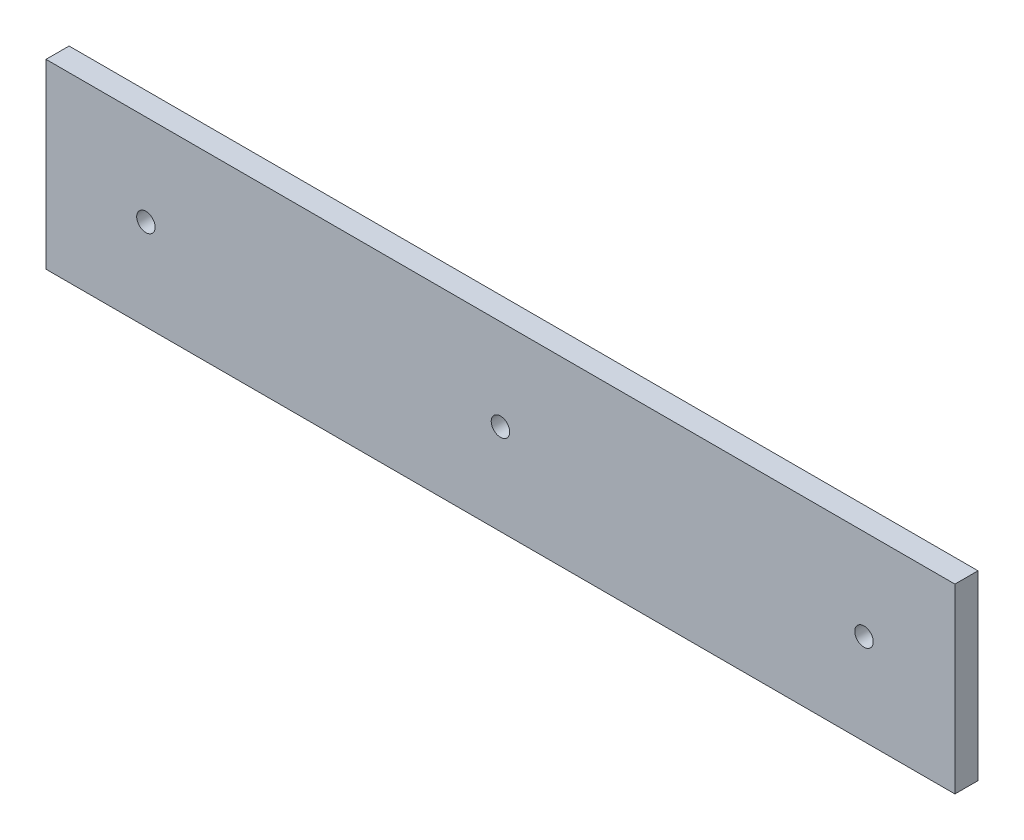
ISO-10303-21;
HEADER;
FILE_DESCRIPTION(('STEP AP214'),'2;1');
FILE_NAME('part.step','',(''),(''),'','','');
FILE_SCHEMA(('AUTOMOTIVE_DESIGN { 1 0 10303 214 1 1 1 1 }'));
ENDSEC;
DATA;
#1=APPLICATION_CONTEXT('core data for automotive mechanical design processes');
#2=APPLICATION_PROTOCOL_DEFINITION('international standard','automotive_design',2000,#1);
#3=PRODUCT_CONTEXT('',#1,'mechanical');
#4=PRODUCT('Part','Part','',(#3));
#5=PRODUCT_RELATED_PRODUCT_CATEGORY('part','',(#4));
#6=PRODUCT_DEFINITION_FORMATION('','',#4);
#7=PRODUCT_DEFINITION_CONTEXT('part definition',#1,'design');
#8=PRODUCT_DEFINITION('design','',#6,#7);
#9=PRODUCT_DEFINITION_SHAPE('','',#8);
#10=(LENGTH_UNIT() NAMED_UNIT(*) SI_UNIT(.MILLI.,.METRE.));
#11=(NAMED_UNIT(*) PLANE_ANGLE_UNIT() SI_UNIT($,.RADIAN.));
#12=(NAMED_UNIT(*) SI_UNIT($,.STERADIAN.) SOLID_ANGLE_UNIT());
#13=UNCERTAINTY_MEASURE_WITH_UNIT(LENGTH_MEASURE(1.E-05),#10,'distance_accuracy_value','');
#14=(GEOMETRIC_REPRESENTATION_CONTEXT(3) GLOBAL_UNCERTAINTY_ASSIGNED_CONTEXT((#13)) GLOBAL_UNIT_ASSIGNED_CONTEXT((#10,
#11,#12)) REPRESENTATION_CONTEXT('',''));
#15=CARTESIAN_POINT('',(0.,0.,0.));
#16=DIRECTION('',(0.,0.,1.));
#17=DIRECTION('',(1.,0.,0.));
#18=AXIS2_PLACEMENT_3D('',#15,#16,#17);
#19=CARTESIAN_POINT('',(0.,0.,2.54));
#20=DIRECTION('',(0.,0.,1.));
#21=DIRECTION('',(1.,0.,0.));
#22=AXIS2_PLACEMENT_3D('',#19,#20,#21);
#23=PLANE('',#22);
#24=CARTESIAN_POINT('',(-40.7925,62.5612625016296,2.54));
#25=DIRECTION('',(0.,0.,1.));
#26=DIRECTION('',(1.,0.,0.));
#27=AXIS2_PLACEMENT_3D('',#24,#25,#26);
#28=CIRCLE('',#27,1.016);
#29=CARTESIAN_POINT('',(-39.7765,62.5612625016296,2.54));
#30=VERTEX_POINT('',#29);
#31=EDGE_CURVE('E115',#30,#30,#28,.T.);
#32=ORIENTED_EDGE('',*,*,#31,.F.);
#33=EDGE_LOOP('',(#32));
#34=FACE_BOUND('',#33,.T.);
#35=DIRECTION('',(0.,-1.,0.));
#36=VECTOR('',#35,1.);
#37=CARTESIAN_POINT('',(-51.785,72.5612625016296,2.54));
#38=LINE('',#37,#36);
#39=CARTESIAN_POINT('',(-51.785,72.5612625016296,2.54));
#40=VERTEX_POINT('',#39);
#41=CARTESIAN_POINT('',(-51.785,52.5612625016296,2.54));
#42=VERTEX_POINT('',#41);
#43=EDGE_CURVE('E85',#40,#42,#38,.T.);
#44=ORIENTED_EDGE('',*,*,#43,.T.);
#45=DIRECTION('',(1.,0.,0.));
#46=VECTOR('',#45,1.);
#47=CARTESIAN_POINT('',(-51.785,52.5612625016296,2.54));
#48=LINE('',#47,#46);
#49=CARTESIAN_POINT('',(48.215,52.5612625016296,2.54));
#50=VERTEX_POINT('',#49);
#51=EDGE_CURVE('E80',#42,#50,#48,.T.);
#52=ORIENTED_EDGE('',*,*,#51,.T.);
#53=DIRECTION('',(0.,1.,0.));
#54=VECTOR('',#53,1.);
#55=CARTESIAN_POINT('',(48.215,72.5612625016296,2.54));
#56=LINE('',#55,#54);
#57=CARTESIAN_POINT('',(48.215,72.5612625016296,2.54));
#58=VERTEX_POINT('',#57);
#59=EDGE_CURVE('E83',#50,#58,#56,.T.);
#60=ORIENTED_EDGE('',*,*,#59,.T.);
#61=DIRECTION('',(-1.,0.,0.));
#62=VECTOR('',#61,1.);
#63=CARTESIAN_POINT('',(-51.785,72.5612625016296,2.54));
#64=LINE('',#63,#62);
#65=EDGE_CURVE('E50',#58,#40,#64,.T.);
#66=ORIENTED_EDGE('',*,*,#65,.T.);
#67=EDGE_LOOP('',(#44,#52,#60,#66));
#68=FACE_BOUND('',#67,.T.);
#69=CARTESIAN_POINT('',(-1.78500000000004,62.5612625016296,2.54));
#70=DIRECTION('',(0.,0.,1.));
#71=DIRECTION('',(1.,0.,0.));
#72=AXIS2_PLACEMENT_3D('',#69,#70,#71);
#73=CIRCLE('',#72,1.016);
#74=CARTESIAN_POINT('',(-0.769000000000039,62.5612625016296,2.54));
#75=VERTEX_POINT('',#74);
#76=EDGE_CURVE('E100',#75,#75,#73,.T.);
#77=ORIENTED_EDGE('',*,*,#76,.F.);
#78=EDGE_LOOP('',(#77));
#79=FACE_BOUND('',#78,.T.);
#80=CARTESIAN_POINT('',(38.215,62.5612625016297,2.54));
#81=DIRECTION('',(0.,0.,1.));
#82=DIRECTION('',(1.,0.,0.));
#83=AXIS2_PLACEMENT_3D('',#80,#81,#82);
#84=CIRCLE('',#83,1.016);
#85=CARTESIAN_POINT('',(39.231,62.5612625016297,2.54));
#86=VERTEX_POINT('',#85);
#87=EDGE_CURVE('E121',#86,#86,#84,.T.);
#88=ORIENTED_EDGE('',*,*,#87,.F.);
#89=EDGE_LOOP('',(#88));
#90=FACE_BOUND('',#89,.T.);
#91=ADVANCED_FACE('F33',(#34,#68,#79,#90),#23,.T.);
#92=CARTESIAN_POINT('',(0.,0.,0.));
#93=DIRECTION('',(0.,0.,1.));
#94=DIRECTION('',(1.,0.,0.));
#95=AXIS2_PLACEMENT_3D('',#92,#93,#94);
#96=PLANE('',#95);
#97=CARTESIAN_POINT('',(-40.7925,62.5612625016296,0.));
#98=DIRECTION('',(0.,0.,1.));
#99=DIRECTION('',(1.,0.,0.));
#100=AXIS2_PLACEMENT_3D('',#97,#98,#99);
#101=CIRCLE('',#100,1.016);
#102=CARTESIAN_POINT('',(-39.7765,62.5612625016296,0.));
#103=VERTEX_POINT('',#102);
#104=EDGE_CURVE('E118',#103,#103,#101,.T.);
#105=ORIENTED_EDGE('',*,*,#104,.T.);
#106=EDGE_LOOP('',(#105));
#107=FACE_BOUND('',#106,.T.);
#108=DIRECTION('',(0.,-1.,0.));
#109=VECTOR('',#108,1.);
#110=CARTESIAN_POINT('',(-51.785,72.5612625016296,0.));
#111=LINE('',#110,#109);
#112=CARTESIAN_POINT('',(-51.785,72.5612625016296,0.));
#113=VERTEX_POINT('',#112);
#114=CARTESIAN_POINT('',(-51.785,52.5612625016296,0.));
#115=VERTEX_POINT('',#114);
#116=EDGE_CURVE('E97',#113,#115,#111,.T.);
#117=ORIENTED_EDGE('',*,*,#116,.F.);
#118=DIRECTION('',(-1.,0.,0.));
#119=VECTOR('',#118,1.);
#120=CARTESIAN_POINT('',(-51.785,72.5612625016296,0.));
#121=LINE('',#120,#119);
#122=CARTESIAN_POINT('',(48.215,72.5612625016296,0.));
#123=VERTEX_POINT('',#122);
#124=EDGE_CURVE('E73',#123,#113,#121,.T.);
#125=ORIENTED_EDGE('',*,*,#124,.F.);
#126=DIRECTION('',(0.,1.,0.));
#127=VECTOR('',#126,1.);
#128=CARTESIAN_POINT('',(48.215,72.5612625016296,0.));
#129=LINE('',#128,#127);
#130=CARTESIAN_POINT('',(48.215,52.5612625016296,0.));
#131=VERTEX_POINT('',#130);
#132=EDGE_CURVE('E67',#131,#123,#129,.T.);
#133=ORIENTED_EDGE('',*,*,#132,.F.);
#134=DIRECTION('',(1.,0.,0.));
#135=VECTOR('',#134,1.);
#136=CARTESIAN_POINT('',(-51.785,52.5612625016296,0.));
#137=LINE('',#136,#135);
#138=EDGE_CURVE('E89',#115,#131,#137,.T.);
#139=ORIENTED_EDGE('',*,*,#138,.F.);
#140=EDGE_LOOP('',(#117,#125,#133,#139));
#141=FACE_BOUND('',#140,.T.);
#142=CARTESIAN_POINT('',(-1.78500000000004,62.5612625016296,0.));
#143=DIRECTION('',(0.,0.,1.));
#144=DIRECTION('',(1.,0.,0.));
#145=AXIS2_PLACEMENT_3D('',#142,#143,#144);
#146=CIRCLE('',#145,1.016);
#147=CARTESIAN_POINT('',(-0.769000000000039,62.5612625016296,0.));
#148=VERTEX_POINT('',#147);
#149=EDGE_CURVE('E112',#148,#148,#146,.T.);
#150=ORIENTED_EDGE('',*,*,#149,.T.);
#151=EDGE_LOOP('',(#150));
#152=FACE_BOUND('',#151,.T.);
#153=CARTESIAN_POINT('',(38.215,62.5612625016297,0.));
#154=DIRECTION('',(0.,0.,1.));
#155=DIRECTION('',(1.,0.,0.));
#156=AXIS2_PLACEMENT_3D('',#153,#154,#155);
#157=CIRCLE('',#156,1.016);
#158=CARTESIAN_POINT('',(39.231,62.5612625016297,0.));
#159=VERTEX_POINT('',#158);
#160=EDGE_CURVE('E124',#159,#159,#157,.T.);
#161=ORIENTED_EDGE('',*,*,#160,.T.);
#162=EDGE_LOOP('',(#161));
#163=FACE_BOUND('',#162,.T.);
#164=ADVANCED_FACE('F108',(#107,#141,#152,#163),#96,.F.);
#165=CARTESIAN_POINT('',(-51.785,72.5612625016296,2.54));
#166=DIRECTION('',(1.,0.,0.));
#167=DIRECTION('',(0.,0.,-1.));
#168=AXIS2_PLACEMENT_3D('',#165,#166,#167);
#169=PLANE('',#168);
#170=ORIENTED_EDGE('',*,*,#116,.T.);
#171=DIRECTION('',(0.,0.,-1.));
#172=VECTOR('',#171,1.);
#173=CARTESIAN_POINT('',(-51.785,52.5612625016296,2.54));
#174=LINE('',#173,#172);
#175=EDGE_CURVE('E11',#42,#115,#174,.T.);
#176=ORIENTED_EDGE('',*,*,#175,.F.);
#177=ORIENTED_EDGE('',*,*,#43,.F.);
#178=DIRECTION('',(0.,0.,-1.));
#179=VECTOR('',#178,1.);
#180=CARTESIAN_POINT('',(-51.785,72.5612625016296,2.54));
#181=LINE('',#180,#179);
#182=EDGE_CURVE('E93',#40,#113,#181,.T.);
#183=ORIENTED_EDGE('',*,*,#182,.T.);
#184=EDGE_LOOP('',(#170,#176,#177,#183));
#185=FACE_BOUND('',#184,.T.);
#186=ADVANCED_FACE('F35',(#185),#169,.F.);
#187=CARTESIAN_POINT('',(-51.785,52.5612625016296,2.54));
#188=DIRECTION('',(0.,1.,0.));
#189=DIRECTION('',(0.,0.,1.));
#190=AXIS2_PLACEMENT_3D('',#187,#188,#189);
#191=PLANE('',#190);
#192=ORIENTED_EDGE('',*,*,#138,.T.);
#193=DIRECTION('',(0.,0.,-1.));
#194=VECTOR('',#193,1.);
#195=CARTESIAN_POINT('',(48.215,52.5612625016296,2.54));
#196=LINE('',#195,#194);
#197=EDGE_CURVE('E42',#50,#131,#196,.T.);
#198=ORIENTED_EDGE('',*,*,#197,.F.);
#199=ORIENTED_EDGE('',*,*,#51,.F.);
#200=ORIENTED_EDGE('',*,*,#175,.T.);
#201=EDGE_LOOP('',(#192,#198,#199,#200));
#202=FACE_BOUND('',#201,.T.);
#203=ADVANCED_FACE('F88',(#202),#191,.F.);
#204=CARTESIAN_POINT('',(48.215,72.5612625016296,2.54));
#205=DIRECTION('',(-1.,0.,0.));
#206=DIRECTION('',(0.,0.,1.));
#207=AXIS2_PLACEMENT_3D('',#204,#205,#206);
#208=PLANE('',#207);
#209=ORIENTED_EDGE('',*,*,#132,.T.);
#210=DIRECTION('',(0.,0.,-1.));
#211=VECTOR('',#210,1.);
#212=CARTESIAN_POINT('',(48.215,72.5612625016296,2.54));
#213=LINE('',#212,#211);
#214=EDGE_CURVE('E90',#58,#123,#213,.T.);
#215=ORIENTED_EDGE('',*,*,#214,.F.);
#216=ORIENTED_EDGE('',*,*,#59,.F.);
#217=ORIENTED_EDGE('',*,*,#197,.T.);
#218=EDGE_LOOP('',(#209,#215,#216,#217));
#219=FACE_BOUND('',#218,.T.);
#220=ADVANCED_FACE('F91',(#219),#208,.F.);
#221=CARTESIAN_POINT('',(-51.785,72.5612625016296,2.54));
#222=DIRECTION('',(0.,-1.,0.));
#223=DIRECTION('',(0.,0.,-1.));
#224=AXIS2_PLACEMENT_3D('',#221,#222,#223);
#225=PLANE('',#224);
#226=ORIENTED_EDGE('',*,*,#124,.T.);
#227=ORIENTED_EDGE('',*,*,#182,.F.);
#228=ORIENTED_EDGE('',*,*,#65,.F.);
#229=ORIENTED_EDGE('',*,*,#214,.T.);
#230=EDGE_LOOP('',(#226,#227,#228,#229));
#231=FACE_BOUND('',#230,.T.);
#232=ADVANCED_FACE('F105',(#231),#225,.F.);
#233=CARTESIAN_POINT('',(-1.78500000000004,62.5612625016296,2.54));
#234=DIRECTION('',(0.,0.,-1.));
#235=DIRECTION('',(-1.,0.,0.));
#236=AXIS2_PLACEMENT_3D('',#233,#234,#235);
#237=CYLINDRICAL_SURFACE('',#236,1.016);
#238=ORIENTED_EDGE('',*,*,#76,.T.);
#239=EDGE_LOOP('',(#238));
#240=FACE_BOUND('',#239,.T.);
#241=ORIENTED_EDGE('',*,*,#149,.F.);
#242=EDGE_LOOP('',(#241));
#243=FACE_BOUND('',#242,.T.);
#244=ADVANCED_FACE('F143',(#240,#243),#237,.F.);
#245=CARTESIAN_POINT('',(-40.7925,62.5612625016296,2.54));
#246=DIRECTION('',(0.,0.,-1.));
#247=DIRECTION('',(-1.,0.,0.));
#248=AXIS2_PLACEMENT_3D('',#245,#246,#247);
#249=CYLINDRICAL_SURFACE('',#248,1.016);
#250=ORIENTED_EDGE('',*,*,#31,.T.);
#251=EDGE_LOOP('',(#250));
#252=FACE_BOUND('',#251,.T.);
#253=ORIENTED_EDGE('',*,*,#104,.F.);
#254=EDGE_LOOP('',(#253));
#255=FACE_BOUND('',#254,.T.);
#256=ADVANCED_FACE('F189',(#252,#255),#249,.F.);
#257=CARTESIAN_POINT('',(38.215,62.5612625016297,2.54));
#258=DIRECTION('',(0.,0.,-1.));
#259=DIRECTION('',(-1.,0.,0.));
#260=AXIS2_PLACEMENT_3D('',#257,#258,#259);
#261=CYLINDRICAL_SURFACE('',#260,1.016);
#262=ORIENTED_EDGE('',*,*,#87,.T.);
#263=EDGE_LOOP('',(#262));
#264=FACE_BOUND('',#263,.T.);
#265=ORIENTED_EDGE('',*,*,#160,.F.);
#266=EDGE_LOOP('',(#265));
#267=FACE_BOUND('',#266,.T.);
#268=ADVANCED_FACE('F130',(#264,#267),#261,.F.);
#269=CLOSED_SHELL('',(#91,#164,#186,#203,#220,#232,#244,#256,#268));
#270=MANIFOLD_SOLID_BREP('B2',#269);
#271=ADVANCED_BREP_SHAPE_REPRESENTATION('',(#18,#270),#14);
#272=SHAPE_DEFINITION_REPRESENTATION(#9,#271);
ENDSEC;
END-ISO-10303-21;
